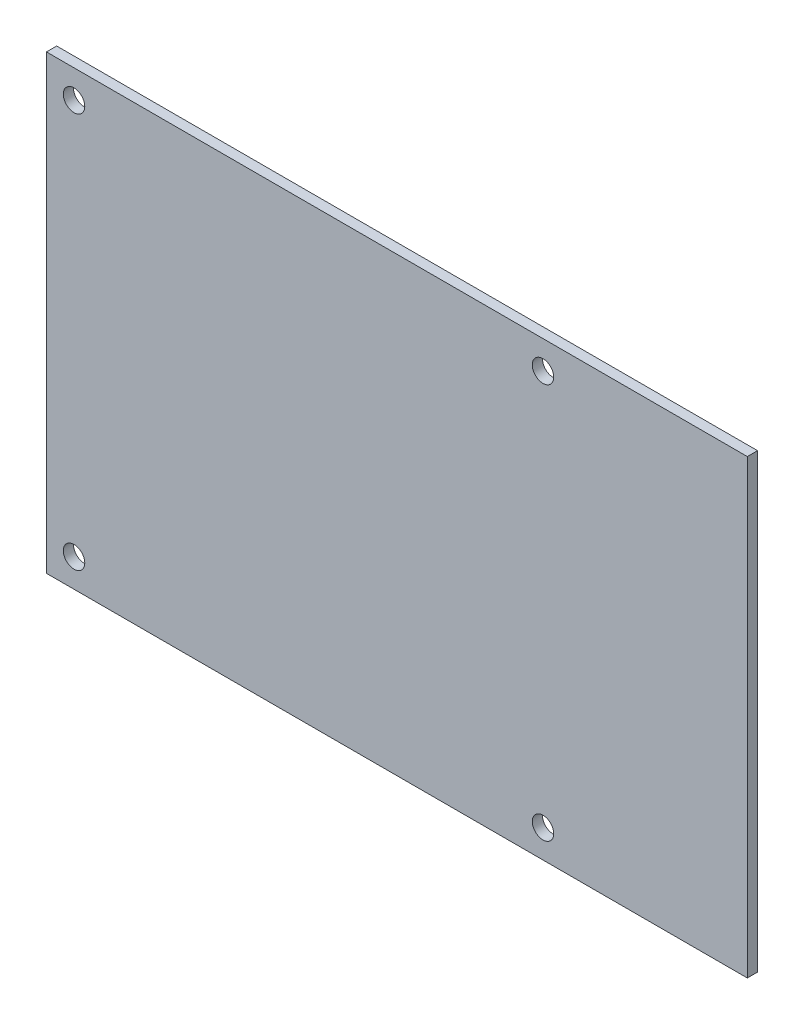
ISO-10303-21;
HEADER;
FILE_DESCRIPTION(('STEP AP214'),'2;1');
FILE_NAME('part.step','',(''),(''),'','','');
FILE_SCHEMA(('AUTOMOTIVE_DESIGN { 1 0 10303 214 1 1 1 1 }'));
ENDSEC;
DATA;
#1=APPLICATION_CONTEXT('core data for automotive mechanical design processes');
#2=APPLICATION_PROTOCOL_DEFINITION('international standard','automotive_design',2000,#1);
#3=PRODUCT_CONTEXT('',#1,'mechanical');
#4=PRODUCT('Part','Part','',(#3));
#5=PRODUCT_RELATED_PRODUCT_CATEGORY('part','',(#4));
#6=PRODUCT_DEFINITION_FORMATION('','',#4);
#7=PRODUCT_DEFINITION_CONTEXT('part definition',#1,'design');
#8=PRODUCT_DEFINITION('design','',#6,#7);
#9=PRODUCT_DEFINITION_SHAPE('','',#8);
#10=(LENGTH_UNIT() NAMED_UNIT(*) SI_UNIT(.MILLI.,.METRE.));
#11=(NAMED_UNIT(*) PLANE_ANGLE_UNIT() SI_UNIT($,.RADIAN.));
#12=(NAMED_UNIT(*) SI_UNIT($,.STERADIAN.) SOLID_ANGLE_UNIT());
#13=UNCERTAINTY_MEASURE_WITH_UNIT(LENGTH_MEASURE(1.E-05),#10,'distance_accuracy_value','');
#14=(GEOMETRIC_REPRESENTATION_CONTEXT(3) GLOBAL_UNCERTAINTY_ASSIGNED_CONTEXT((#13)) GLOBAL_UNIT_ASSIGNED_CONTEXT((#10,
#11,#12)) REPRESENTATION_CONTEXT('',''));
#15=CARTESIAN_POINT('',(0.,0.,0.));
#16=DIRECTION('',(0.,0.,1.));
#17=DIRECTION('',(1.,0.,0.));
#18=AXIS2_PLACEMENT_3D('',#15,#16,#17);
#19=CARTESIAN_POINT('',(0.,0.,1.27));
#20=DIRECTION('',(0.,0.,-1.));
#21=DIRECTION('',(-1.,0.,0.));
#22=AXIS2_PLACEMENT_3D('',#19,#20,#21);
#23=PLANE('',#22);
#24=DIRECTION('',(0.,-1.,0.));
#25=VECTOR('',#24,1.);
#26=CARTESIAN_POINT('',(0.,0.,1.27));
#27=LINE('',#26,#25);
#28=CARTESIAN_POINT('',(0.,56.134,1.27));
#29=VERTEX_POINT('',#28);
#30=CARTESIAN_POINT('',(0.,0.,1.27));
#31=VERTEX_POINT('',#30);
#32=EDGE_CURVE('E85',#29,#31,#27,.T.);
#33=ORIENTED_EDGE('',*,*,#32,.T.);
#34=DIRECTION('',(1.,0.,0.));
#35=VECTOR('',#34,1.);
#36=CARTESIAN_POINT('',(0.,0.,1.27));
#37=LINE('',#36,#35);
#38=CARTESIAN_POINT('',(87.122,0.,1.27));
#39=VERTEX_POINT('',#38);
#40=EDGE_CURVE('E80',#31,#39,#37,.T.);
#41=ORIENTED_EDGE('',*,*,#40,.T.);
#42=DIRECTION('',(0.,1.,0.));
#43=VECTOR('',#42,1.);
#44=CARTESIAN_POINT('',(87.122,0.,1.27));
#45=LINE('',#44,#43);
#46=CARTESIAN_POINT('',(87.122,56.134,1.27));
#47=VERTEX_POINT('',#46);
#48=EDGE_CURVE('E83',#39,#47,#45,.T.);
#49=ORIENTED_EDGE('',*,*,#48,.T.);
#50=DIRECTION('',(-1.,0.,0.));
#51=VECTOR('',#50,1.);
#52=CARTESIAN_POINT('',(0.,56.134,1.27));
#53=LINE('',#52,#51);
#54=EDGE_CURVE('E50',#47,#29,#53,.T.);
#55=ORIENTED_EDGE('',*,*,#54,.T.);
#56=EDGE_LOOP('',(#33,#41,#49,#55));
#57=FACE_BOUND('',#56,.T.);
#58=CARTESIAN_POINT('',(3.429,52.6415,1.27));
#59=DIRECTION('',(0.,0.,1.));
#60=DIRECTION('',(1.,0.,0.));
#61=AXIS2_PLACEMENT_3D('',#58,#59,#60);
#62=CIRCLE('',#61,1.3335);
#63=CARTESIAN_POINT('',(4.76250000000001,52.6415,1.27));
#64=VERTEX_POINT('',#63);
#65=EDGE_CURVE('E100',#64,#64,#62,.T.);
#66=ORIENTED_EDGE('',*,*,#65,.F.);
#67=EDGE_LOOP('',(#66));
#68=FACE_BOUND('',#67,.T.);
#69=CARTESIAN_POINT('',(61.722,52.6415,1.27));
#70=DIRECTION('',(0.,0.,1.));
#71=DIRECTION('',(1.,0.,0.));
#72=AXIS2_PLACEMENT_3D('',#69,#70,#71);
#73=CIRCLE('',#72,1.33349999999998);
#74=CARTESIAN_POINT('',(63.0555,52.6415,1.27));
#75=VERTEX_POINT('',#74);
#76=EDGE_CURVE('E115',#75,#75,#73,.T.);
#77=ORIENTED_EDGE('',*,*,#76,.F.);
#78=EDGE_LOOP('',(#77));
#79=FACE_BOUND('',#78,.T.);
#80=CARTESIAN_POINT('',(61.722,3.4925,1.27));
#81=DIRECTION('',(0.,0.,1.));
#82=DIRECTION('',(1.,0.,0.));
#83=AXIS2_PLACEMENT_3D('',#80,#81,#82);
#84=CIRCLE('',#83,1.33349999999998);
#85=CARTESIAN_POINT('',(63.0555,3.4925,1.27));
#86=VERTEX_POINT('',#85);
#87=EDGE_CURVE('E121',#86,#86,#84,.T.);
#88=ORIENTED_EDGE('',*,*,#87,.F.);
#89=EDGE_LOOP('',(#88));
#90=FACE_BOUND('',#89,.T.);
#91=CARTESIAN_POINT('',(3.429,3.4925,1.27));
#92=DIRECTION('',(0.,0.,1.));
#93=DIRECTION('',(1.,0.,0.));
#94=AXIS2_PLACEMENT_3D('',#91,#92,#93);
#95=CIRCLE('',#94,1.3335);
#96=CARTESIAN_POINT('',(4.7625,3.4925,1.27));
#97=VERTEX_POINT('',#96);
#98=EDGE_CURVE('E127',#97,#97,#95,.T.);
#99=ORIENTED_EDGE('',*,*,#98,.F.);
#100=EDGE_LOOP('',(#99));
#101=FACE_BOUND('',#100,.T.);
#102=ADVANCED_FACE('F33',(#57,#68,#79,#90,#101),#23,.F.);
#103=CARTESIAN_POINT('',(0.,0.,0.));
#104=DIRECTION('',(0.,0.,-1.));
#105=DIRECTION('',(-1.,0.,0.));
#106=AXIS2_PLACEMENT_3D('',#103,#104,#105);
#107=PLANE('',#106);
#108=CARTESIAN_POINT('',(61.722,3.4925,0.));
#109=DIRECTION('',(0.,0.,1.));
#110=DIRECTION('',(1.,0.,0.));
#111=AXIS2_PLACEMENT_3D('',#108,#109,#110);
#112=CIRCLE('',#111,1.33349999999998);
#113=CARTESIAN_POINT('',(63.0555,3.4925,0.));
#114=VERTEX_POINT('',#113);
#115=EDGE_CURVE('E124',#114,#114,#112,.T.);
#116=ORIENTED_EDGE('',*,*,#115,.T.);
#117=EDGE_LOOP('',(#116));
#118=FACE_BOUND('',#117,.T.);
#119=CARTESIAN_POINT('',(3.429,52.6415,0.));
#120=DIRECTION('',(0.,0.,1.));
#121=DIRECTION('',(1.,0.,0.));
#122=AXIS2_PLACEMENT_3D('',#119,#120,#121);
#123=CIRCLE('',#122,1.3335);
#124=CARTESIAN_POINT('',(4.76250000000001,52.6415,0.));
#125=VERTEX_POINT('',#124);
#126=EDGE_CURVE('E112',#125,#125,#123,.T.);
#127=ORIENTED_EDGE('',*,*,#126,.T.);
#128=EDGE_LOOP('',(#127));
#129=FACE_BOUND('',#128,.T.);
#130=DIRECTION('',(0.,-1.,0.));
#131=VECTOR('',#130,1.);
#132=CARTESIAN_POINT('',(0.,0.,0.));
#133=LINE('',#132,#131);
#134=CARTESIAN_POINT('',(0.,56.134,0.));
#135=VERTEX_POINT('',#134);
#136=CARTESIAN_POINT('',(0.,0.,0.));
#137=VERTEX_POINT('',#136);
#138=EDGE_CURVE('E97',#135,#137,#133,.T.);
#139=ORIENTED_EDGE('',*,*,#138,.F.);
#140=DIRECTION('',(-1.,0.,0.));
#141=VECTOR('',#140,1.);
#142=CARTESIAN_POINT('',(0.,56.134,0.));
#143=LINE('',#142,#141);
#144=CARTESIAN_POINT('',(87.122,56.134,0.));
#145=VERTEX_POINT('',#144);
#146=EDGE_CURVE('E73',#145,#135,#143,.T.);
#147=ORIENTED_EDGE('',*,*,#146,.F.);
#148=DIRECTION('',(0.,1.,0.));
#149=VECTOR('',#148,1.);
#150=CARTESIAN_POINT('',(87.122,0.,0.));
#151=LINE('',#150,#149);
#152=CARTESIAN_POINT('',(87.122,0.,0.));
#153=VERTEX_POINT('',#152);
#154=EDGE_CURVE('E67',#153,#145,#151,.T.);
#155=ORIENTED_EDGE('',*,*,#154,.F.);
#156=DIRECTION('',(1.,0.,0.));
#157=VECTOR('',#156,1.);
#158=CARTESIAN_POINT('',(0.,0.,0.));
#159=LINE('',#158,#157);
#160=EDGE_CURVE('E89',#137,#153,#159,.T.);
#161=ORIENTED_EDGE('',*,*,#160,.F.);
#162=EDGE_LOOP('',(#139,#147,#155,#161));
#163=FACE_BOUND('',#162,.T.);
#164=CARTESIAN_POINT('',(61.722,52.6415,0.));
#165=DIRECTION('',(0.,0.,1.));
#166=DIRECTION('',(1.,0.,0.));
#167=AXIS2_PLACEMENT_3D('',#164,#165,#166);
#168=CIRCLE('',#167,1.33349999999998);
#169=CARTESIAN_POINT('',(63.0555,52.6415,0.));
#170=VERTEX_POINT('',#169);
#171=EDGE_CURVE('E118',#170,#170,#168,.T.);
#172=ORIENTED_EDGE('',*,*,#171,.T.);
#173=EDGE_LOOP('',(#172));
#174=FACE_BOUND('',#173,.T.);
#175=CARTESIAN_POINT('',(3.429,3.4925,0.));
#176=DIRECTION('',(0.,0.,1.));
#177=DIRECTION('',(1.,0.,0.));
#178=AXIS2_PLACEMENT_3D('',#175,#176,#177);
#179=CIRCLE('',#178,1.3335);
#180=CARTESIAN_POINT('',(4.7625,3.4925,0.));
#181=VERTEX_POINT('',#180);
#182=EDGE_CURVE('E130',#181,#181,#179,.T.);
#183=ORIENTED_EDGE('',*,*,#182,.T.);
#184=EDGE_LOOP('',(#183));
#185=FACE_BOUND('',#184,.T.);
#186=ADVANCED_FACE('F108',(#118,#129,#163,#174,#185),#107,.T.);
#187=CARTESIAN_POINT('',(0.,0.,1.27));
#188=DIRECTION('',(1.,0.,0.));
#189=DIRECTION('',(0.,0.,-1.));
#190=AXIS2_PLACEMENT_3D('',#187,#188,#189);
#191=PLANE('',#190);
#192=ORIENTED_EDGE('',*,*,#138,.T.);
#193=DIRECTION('',(0.,0.,-1.));
#194=VECTOR('',#193,1.);
#195=CARTESIAN_POINT('',(0.,0.,1.27));
#196=LINE('',#195,#194);
#197=EDGE_CURVE('E11',#31,#137,#196,.T.);
#198=ORIENTED_EDGE('',*,*,#197,.F.);
#199=ORIENTED_EDGE('',*,*,#32,.F.);
#200=DIRECTION('',(0.,0.,-1.));
#201=VECTOR('',#200,1.);
#202=CARTESIAN_POINT('',(0.,56.134,1.27));
#203=LINE('',#202,#201);
#204=EDGE_CURVE('E93',#29,#135,#203,.T.);
#205=ORIENTED_EDGE('',*,*,#204,.T.);
#206=EDGE_LOOP('',(#192,#198,#199,#205));
#207=FACE_BOUND('',#206,.T.);
#208=ADVANCED_FACE('F35',(#207),#191,.F.);
#209=CARTESIAN_POINT('',(0.,0.,1.27));
#210=DIRECTION('',(0.,1.,0.));
#211=DIRECTION('',(0.,0.,1.));
#212=AXIS2_PLACEMENT_3D('',#209,#210,#211);
#213=PLANE('',#212);
#214=ORIENTED_EDGE('',*,*,#160,.T.);
#215=DIRECTION('',(0.,0.,-1.));
#216=VECTOR('',#215,1.);
#217=CARTESIAN_POINT('',(87.122,0.,1.27));
#218=LINE('',#217,#216);
#219=EDGE_CURVE('E42',#39,#153,#218,.T.);
#220=ORIENTED_EDGE('',*,*,#219,.F.);
#221=ORIENTED_EDGE('',*,*,#40,.F.);
#222=ORIENTED_EDGE('',*,*,#197,.T.);
#223=EDGE_LOOP('',(#214,#220,#221,#222));
#224=FACE_BOUND('',#223,.T.);
#225=ADVANCED_FACE('F88',(#224),#213,.F.);
#226=CARTESIAN_POINT('',(87.122,0.,1.27));
#227=DIRECTION('',(-1.,0.,0.));
#228=DIRECTION('',(0.,0.,1.));
#229=AXIS2_PLACEMENT_3D('',#226,#227,#228);
#230=PLANE('',#229);
#231=ORIENTED_EDGE('',*,*,#154,.T.);
#232=DIRECTION('',(0.,0.,-1.));
#233=VECTOR('',#232,1.);
#234=CARTESIAN_POINT('',(87.122,56.134,1.27));
#235=LINE('',#234,#233);
#236=EDGE_CURVE('E90',#47,#145,#235,.T.);
#237=ORIENTED_EDGE('',*,*,#236,.F.);
#238=ORIENTED_EDGE('',*,*,#48,.F.);
#239=ORIENTED_EDGE('',*,*,#219,.T.);
#240=EDGE_LOOP('',(#231,#237,#238,#239));
#241=FACE_BOUND('',#240,.T.);
#242=ADVANCED_FACE('F91',(#241),#230,.F.);
#243=CARTESIAN_POINT('',(0.,56.134,1.27));
#244=DIRECTION('',(0.,-1.,0.));
#245=DIRECTION('',(0.,0.,-1.));
#246=AXIS2_PLACEMENT_3D('',#243,#244,#245);
#247=PLANE('',#246);
#248=ORIENTED_EDGE('',*,*,#146,.T.);
#249=ORIENTED_EDGE('',*,*,#204,.F.);
#250=ORIENTED_EDGE('',*,*,#54,.F.);
#251=ORIENTED_EDGE('',*,*,#236,.T.);
#252=EDGE_LOOP('',(#248,#249,#250,#251));
#253=FACE_BOUND('',#252,.T.);
#254=ADVANCED_FACE('F105',(#253),#247,.F.);
#255=CARTESIAN_POINT('',(3.429,52.6415,1.27));
#256=DIRECTION('',(0.,0.,-1.));
#257=DIRECTION('',(-1.,0.,0.));
#258=AXIS2_PLACEMENT_3D('',#255,#256,#257);
#259=CYLINDRICAL_SURFACE('',#258,1.3335);
#260=ORIENTED_EDGE('',*,*,#65,.T.);
#261=EDGE_LOOP('',(#260));
#262=FACE_BOUND('',#261,.T.);
#263=ORIENTED_EDGE('',*,*,#126,.F.);
#264=EDGE_LOOP('',(#263));
#265=FACE_BOUND('',#264,.T.);
#266=ADVANCED_FACE('F147',(#262,#265),#259,.F.);
#267=CARTESIAN_POINT('',(61.722,52.6415,1.27));
#268=DIRECTION('',(0.,0.,-1.));
#269=DIRECTION('',(-1.,0.,0.));
#270=AXIS2_PLACEMENT_3D('',#267,#268,#269);
#271=CYLINDRICAL_SURFACE('',#270,1.33349999999998);
#272=ORIENTED_EDGE('',*,*,#76,.T.);
#273=EDGE_LOOP('',(#272));
#274=FACE_BOUND('',#273,.T.);
#275=ORIENTED_EDGE('',*,*,#171,.F.);
#276=EDGE_LOOP('',(#275));
#277=FACE_BOUND('',#276,.T.);
#278=ADVANCED_FACE('F193',(#274,#277),#271,.F.);
#279=CARTESIAN_POINT('',(61.722,3.4925,1.27));
#280=DIRECTION('',(0.,0.,-1.));
#281=DIRECTION('',(-1.,0.,0.));
#282=AXIS2_PLACEMENT_3D('',#279,#280,#281);
#283=CYLINDRICAL_SURFACE('',#282,1.33349999999998);
#284=ORIENTED_EDGE('',*,*,#87,.T.);
#285=EDGE_LOOP('',(#284));
#286=FACE_BOUND('',#285,.T.);
#287=ORIENTED_EDGE('',*,*,#115,.F.);
#288=EDGE_LOOP('',(#287));
#289=FACE_BOUND('',#288,.T.);
#290=ADVANCED_FACE('F201',(#286,#289),#283,.F.);
#291=CARTESIAN_POINT('',(3.429,3.4925,1.27));
#292=DIRECTION('',(0.,0.,-1.));
#293=DIRECTION('',(-1.,0.,0.));
#294=AXIS2_PLACEMENT_3D('',#291,#292,#293);
#295=CYLINDRICAL_SURFACE('',#294,1.3335);
#296=ORIENTED_EDGE('',*,*,#98,.T.);
#297=EDGE_LOOP('',(#296));
#298=FACE_BOUND('',#297,.T.);
#299=ORIENTED_EDGE('',*,*,#182,.F.);
#300=EDGE_LOOP('',(#299));
#301=FACE_BOUND('',#300,.T.);
#302=ADVANCED_FACE('F136',(#298,#301),#295,.F.);
#303=CLOSED_SHELL('',(#102,#186,#208,#225,#242,#254,#266,#278,#290,#302));
#304=MANIFOLD_SOLID_BREP('B2',#303);
#305=ADVANCED_BREP_SHAPE_REPRESENTATION('',(#18,#304),#14);
#306=SHAPE_DEFINITION_REPRESENTATION(#9,#305);
ENDSEC;
END-ISO-10303-21;
